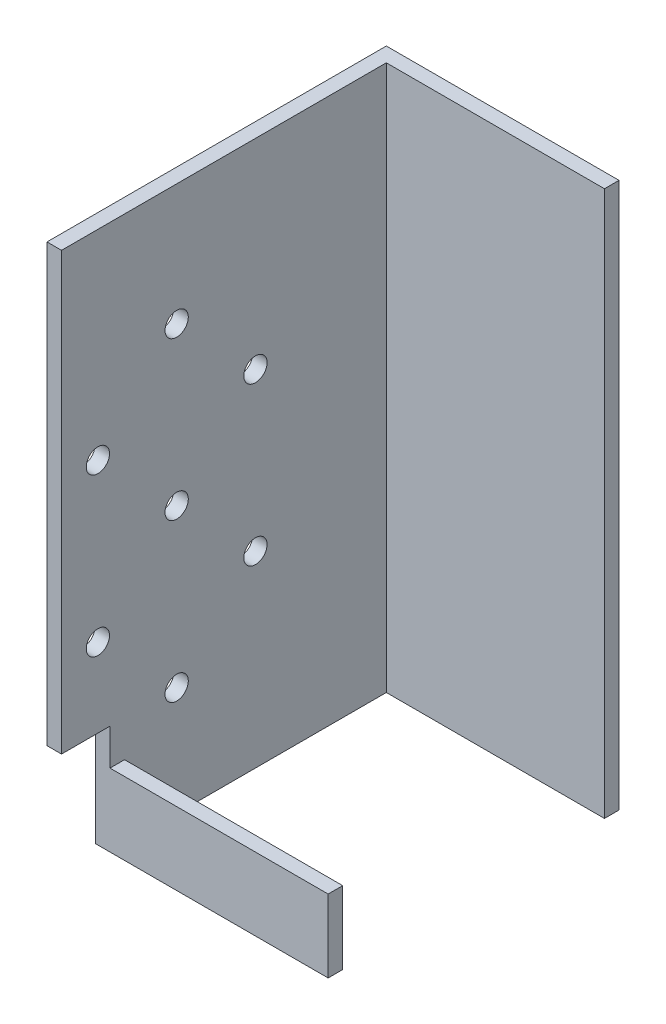
ISO-10303-21;
HEADER;
FILE_DESCRIPTION(('STEP AP214'),'2;1');
FILE_NAME('part.step','',(''),(''),'','','');
FILE_SCHEMA(('AUTOMOTIVE_DESIGN { 1 0 10303 214 1 1 1 1 }'));
ENDSEC;
DATA;
#1=APPLICATION_CONTEXT('core data for automotive mechanical design processes');
#2=APPLICATION_PROTOCOL_DEFINITION('international standard','automotive_design',2000,#1);
#3=PRODUCT_CONTEXT('',#1,'mechanical');
#4=PRODUCT('Part','Part','',(#3));
#5=PRODUCT_RELATED_PRODUCT_CATEGORY('part','',(#4));
#6=PRODUCT_DEFINITION_FORMATION('','',#4);
#7=PRODUCT_DEFINITION_CONTEXT('part definition',#1,'design');
#8=PRODUCT_DEFINITION('design','',#6,#7);
#9=PRODUCT_DEFINITION_SHAPE('','',#8);
#10=(LENGTH_UNIT() NAMED_UNIT(*) SI_UNIT(.MILLI.,.METRE.));
#11=(NAMED_UNIT(*) PLANE_ANGLE_UNIT() SI_UNIT($,.RADIAN.));
#12=(NAMED_UNIT(*) SI_UNIT($,.STERADIAN.) SOLID_ANGLE_UNIT());
#13=UNCERTAINTY_MEASURE_WITH_UNIT(LENGTH_MEASURE(1.E-05),#10,'distance_accuracy_value','');
#14=(GEOMETRIC_REPRESENTATION_CONTEXT(3) GLOBAL_UNCERTAINTY_ASSIGNED_CONTEXT((#13)) GLOBAL_UNIT_ASSIGNED_CONTEXT((#10,
#11,#12)) REPRESENTATION_CONTEXT('',''));
#15=CARTESIAN_POINT('',(0.,0.,0.));
#16=DIRECTION('',(0.,0.,1.));
#17=DIRECTION('',(1.,0.,0.));
#18=AXIS2_PLACEMENT_3D('',#15,#16,#17);
#19=CARTESIAN_POINT('',(1.524,0.,0.));
#20=DIRECTION('',(-1.,0.,0.));
#21=DIRECTION('',(0.,0.,1.));
#22=AXIS2_PLACEMENT_3D('',#19,#20,#21);
#23=PLANE('',#22);
#24=CARTESIAN_POINT('',(1.524,36.195,1.27));
#25=DIRECTION('',(1.,0.,0.));
#26=DIRECTION('',(0.,0.,-1.));
#27=AXIS2_PLACEMENT_3D('',#24,#25,#26);
#28=CIRCLE('',#27,1.21919999999999);
#29=CARTESIAN_POINT('',(1.524,36.195,0.0508000000000088));
#30=VERTEX_POINT('',#29);
#31=EDGE_CURVE('E465',#30,#30,#28,.T.);
#32=ORIENTED_EDGE('',*,*,#31,.F.);
#33=EDGE_LOOP('',(#32));
#34=FACE_BOUND('',#33,.T.);
#35=CARTESIAN_POINT('',(1.524,36.195,-15.24));
#36=DIRECTION('',(1.,0.,0.));
#37=DIRECTION('',(0.,0.,-1.));
#38=AXIS2_PLACEMENT_3D('',#35,#36,#37);
#39=CIRCLE('',#38,1.21919999999999);
#40=CARTESIAN_POINT('',(1.524,36.195,-16.4592));
#41=VERTEX_POINT('',#40);
#42=EDGE_CURVE('E467',#41,#41,#39,.T.);
#43=ORIENTED_EDGE('',*,*,#42,.F.);
#44=EDGE_LOOP('',(#43));
#45=FACE_BOUND('',#44,.T.);
#46=CARTESIAN_POINT('',(1.524,44.45,-6.985));
#47=DIRECTION('',(1.,0.,0.));
#48=DIRECTION('',(0.,0.,-1.));
#49=AXIS2_PLACEMENT_3D('',#46,#47,#48);
#50=CIRCLE('',#49,1.21919999999999);
#51=CARTESIAN_POINT('',(1.524,44.45,-8.20419999999999));
#52=VERTEX_POINT('',#51);
#53=EDGE_CURVE('E475',#52,#52,#50,.T.);
#54=ORIENTED_EDGE('',*,*,#53,.F.);
#55=EDGE_LOOP('',(#54));
#56=FACE_BOUND('',#55,.T.);
#57=CARTESIAN_POINT('',(1.524,27.94,-6.985));
#58=DIRECTION('',(1.,0.,0.));
#59=DIRECTION('',(0.,0.,-1.));
#60=AXIS2_PLACEMENT_3D('',#57,#58,#59);
#61=CIRCLE('',#60,1.21919999999999);
#62=CARTESIAN_POINT('',(1.524,27.94,-8.20419999999999));
#63=VERTEX_POINT('',#62);
#64=EDGE_CURVE('E481',#63,#63,#61,.T.);
#65=ORIENTED_EDGE('',*,*,#64,.F.);
#66=EDGE_LOOP('',(#65));
#67=FACE_BOUND('',#66,.T.);
#68=CARTESIAN_POINT('',(1.524,11.43,-6.985));
#69=DIRECTION('',(1.,0.,0.));
#70=DIRECTION('',(0.,0.,-1.));
#71=AXIS2_PLACEMENT_3D('',#68,#69,#70);
#72=CIRCLE('',#71,1.21919999999999);
#73=CARTESIAN_POINT('',(1.524,11.43,-8.20419999999999));
#74=VERTEX_POINT('',#73);
#75=EDGE_CURVE('E487',#74,#74,#72,.T.);
#76=ORIENTED_EDGE('',*,*,#75,.F.);
#77=EDGE_LOOP('',(#76));
#78=FACE_BOUND('',#77,.T.);
#79=CARTESIAN_POINT('',(1.524,19.685,-15.24));
#80=DIRECTION('',(1.,0.,0.));
#81=DIRECTION('',(0.,0.,-1.));
#82=AXIS2_PLACEMENT_3D('',#79,#80,#81);
#83=CIRCLE('',#82,1.21919999999999);
#84=CARTESIAN_POINT('',(1.524,19.685,-16.4592));
#85=VERTEX_POINT('',#84);
#86=EDGE_CURVE('E493',#85,#85,#83,.T.);
#87=ORIENTED_EDGE('',*,*,#86,.F.);
#88=EDGE_LOOP('',(#87));
#89=FACE_BOUND('',#88,.T.);
#90=DIRECTION('',(0.,1.,0.));
#91=VECTOR('',#90,1.);
#92=CARTESIAN_POINT('',(1.524,0.,-1.524));
#93=LINE('',#92,#91);
#94=CARTESIAN_POINT('',(1.524,0.,-1.524));
#95=VERTEX_POINT('',#94);
#96=CARTESIAN_POINT('',(1.524,7.62,-1.524));
#97=VERTEX_POINT('',#96);
#98=EDGE_CURVE('E169',#95,#97,#93,.T.);
#99=ORIENTED_EDGE('',*,*,#98,.F.);
#100=DIRECTION('',(0.,0.,-1.));
#101=VECTOR('',#100,1.);
#102=CARTESIAN_POINT('',(1.524,0.,0.));
#103=LINE('',#102,#101);
#104=CARTESIAN_POINT('',(1.524,0.,-28.956));
#105=VERTEX_POINT('',#104);
#106=EDGE_CURVE('E130',#95,#105,#103,.T.);
#107=ORIENTED_EDGE('',*,*,#106,.T.);
#108=DIRECTION('',(0.,-1.,0.));
#109=VECTOR('',#108,1.);
#110=CARTESIAN_POINT('',(1.524,0.,-28.956));
#111=LINE('',#110,#109);
#112=CARTESIAN_POINT('',(1.524,57.15,-28.956));
#113=VERTEX_POINT('',#112);
#114=EDGE_CURVE('E125',#113,#105,#111,.T.);
#115=ORIENTED_EDGE('',*,*,#114,.F.);
#116=DIRECTION('',(0.,0.,1.));
#117=VECTOR('',#116,1.);
#118=CARTESIAN_POINT('',(1.524,57.15,0.));
#119=LINE('',#118,#117);
#120=CARTESIAN_POINT('',(1.524,57.15,5.08));
#121=VERTEX_POINT('',#120);
#122=EDGE_CURVE('E118',#113,#121,#119,.T.);
#123=ORIENTED_EDGE('',*,*,#122,.T.);
#124=DIRECTION('',(0.,1.,0.));
#125=VECTOR('',#124,1.);
#126=CARTESIAN_POINT('',(1.524,57.15,5.08));
#127=LINE('',#126,#125);
#128=CARTESIAN_POINT('',(1.52400000000001,11.43,5.08));
#129=VERTEX_POINT('',#128);
#130=EDGE_CURVE('E123',#129,#121,#127,.T.);
#131=ORIENTED_EDGE('',*,*,#130,.F.);
#132=DIRECTION('',(0.,0.,-1.));
#133=VECTOR('',#132,1.);
#134=CARTESIAN_POINT('',(1.52400000000001,11.43,5.08));
#135=LINE('',#134,#133);
#136=CARTESIAN_POINT('',(1.52400000000001,11.43,0.));
#137=VERTEX_POINT('',#136);
#138=EDGE_CURVE('E154',#129,#137,#135,.T.);
#139=ORIENTED_EDGE('',*,*,#138,.T.);
#140=DIRECTION('',(0.,-1.,0.));
#141=VECTOR('',#140,1.);
#142=CARTESIAN_POINT('',(1.524,0.,0.));
#143=LINE('',#142,#141);
#144=CARTESIAN_POINT('',(1.524,7.62,0.));
#145=VERTEX_POINT('',#144);
#146=EDGE_CURVE('E161',#137,#145,#143,.T.);
#147=ORIENTED_EDGE('',*,*,#146,.T.);
#148=DIRECTION('',(0.,0.,1.));
#149=VECTOR('',#148,1.);
#150=CARTESIAN_POINT('',(1.524,7.62,0.));
#151=LINE('',#150,#149);
#152=EDGE_CURVE('E58',#97,#145,#151,.T.);
#153=ORIENTED_EDGE('',*,*,#152,.F.);
#154=EDGE_LOOP('',(#99,#107,#115,#123,#131,#139,#147,#153));
#155=FACE_BOUND('',#154,.T.);
#156=CARTESIAN_POINT('',(1.524,19.685,1.27));
#157=DIRECTION('',(1.,0.,0.));
#158=DIRECTION('',(0.,0.,-1.));
#159=AXIS2_PLACEMENT_3D('',#156,#157,#158);
#160=CIRCLE('',#159,1.21919999999999);
#161=CARTESIAN_POINT('',(1.524,19.685,0.0508000000000086));
#162=VERTEX_POINT('',#161);
#163=EDGE_CURVE('E149',#162,#162,#160,.T.);
#164=ORIENTED_EDGE('',*,*,#163,.F.);
#165=EDGE_LOOP('',(#164));
#166=FACE_BOUND('',#165,.T.);
#167=ADVANCED_FACE('F33',(#34,#45,#56,#67,#78,#89,#155,#166),#23,.F.);
#168=CARTESIAN_POINT('',(1.524,0.,0.));
#169=DIRECTION('',(0.,0.,-1.));
#170=DIRECTION('',(0.,1.,0.));
#171=AXIS2_PLACEMENT_3D('',#168,#169,#170);
#172=PLANE('',#171);
#173=DIRECTION('',(1.,0.,0.));
#174=VECTOR('',#173,1.);
#175=CARTESIAN_POINT('',(1.52400000000001,11.43,0.));
#176=LINE('',#175,#174);
#177=CARTESIAN_POINT('',(0.,11.43,0.));
#178=VERTEX_POINT('',#177);
#179=EDGE_CURVE('E50',#178,#137,#176,.T.);
#180=ORIENTED_EDGE('',*,*,#179,.F.);
#181=DIRECTION('',(0.,-1.,0.));
#182=VECTOR('',#181,1.);
#183=CARTESIAN_POINT('',(0.,0.,0.));
#184=LINE('',#183,#182);
#185=CARTESIAN_POINT('',(0.,0.,0.));
#186=VERTEX_POINT('',#185);
#187=EDGE_CURVE('E213',#178,#186,#184,.T.);
#188=ORIENTED_EDGE('',*,*,#187,.T.);
#189=DIRECTION('',(-1.,0.,0.));
#190=VECTOR('',#189,1.);
#191=CARTESIAN_POINT('',(1.524,0.,0.));
#192=LINE('',#191,#190);
#193=CARTESIAN_POINT('',(24.384,0.,0.));
#194=VERTEX_POINT('',#193);
#195=EDGE_CURVE('E11',#194,#186,#192,.T.);
#196=ORIENTED_EDGE('',*,*,#195,.F.);
#197=DIRECTION('',(0.,-1.,0.));
#198=VECTOR('',#197,1.);
#199=CARTESIAN_POINT('',(24.384,0.,0.));
#200=LINE('',#199,#198);
#201=CARTESIAN_POINT('',(24.384,7.62,0.));
#202=VERTEX_POINT('',#201);
#203=EDGE_CURVE('E157',#202,#194,#200,.T.);
#204=ORIENTED_EDGE('',*,*,#203,.F.);
#205=DIRECTION('',(-1.,0.,0.));
#206=VECTOR('',#205,1.);
#207=CARTESIAN_POINT('',(24.384,7.62,0.));
#208=LINE('',#207,#206);
#209=EDGE_CURVE('E183',#202,#145,#208,.T.);
#210=ORIENTED_EDGE('',*,*,#209,.T.);
#211=ORIENTED_EDGE('',*,*,#146,.F.);
#212=EDGE_LOOP('',(#180,#188,#196,#204,#210,#211));
#213=FACE_BOUND('',#212,.T.);
#214=ADVANCED_FACE('F35',(#213),#172,.F.);
#215=CARTESIAN_POINT('',(1.524,0.,0.));
#216=DIRECTION('',(0.,1.,0.));
#217=DIRECTION('',(0.,0.,1.));
#218=AXIS2_PLACEMENT_3D('',#215,#216,#217);
#219=PLANE('',#218);
#220=DIRECTION('',(0.,0.,-1.));
#221=VECTOR('',#220,1.);
#222=CARTESIAN_POINT('',(0.,0.,0.));
#223=LINE('',#222,#221);
#224=CARTESIAN_POINT('',(0.,0.,-30.48));
#225=VERTEX_POINT('',#224);
#226=EDGE_CURVE('E221',#186,#225,#223,.T.);
#227=ORIENTED_EDGE('',*,*,#226,.T.);
#228=DIRECTION('',(-1.,0.,0.));
#229=VECTOR('',#228,1.);
#230=CARTESIAN_POINT('',(1.524,0.,-30.48));
#231=LINE('',#230,#229);
#232=CARTESIAN_POINT('',(24.384,0.,-30.48));
#233=VERTEX_POINT('',#232);
#234=EDGE_CURVE('E42',#233,#225,#231,.T.);
#235=ORIENTED_EDGE('',*,*,#234,.F.);
#236=DIRECTION('',(0.,0.,-1.));
#237=VECTOR('',#236,1.);
#238=CARTESIAN_POINT('',(24.384,0.,-30.48));
#239=LINE('',#238,#237);
#240=CARTESIAN_POINT('',(24.384,0.,-28.956));
#241=VERTEX_POINT('',#240);
#242=EDGE_CURVE('E197',#241,#233,#239,.T.);
#243=ORIENTED_EDGE('',*,*,#242,.F.);
#244=DIRECTION('',(-1.,0.,0.));
#245=VECTOR('',#244,1.);
#246=CARTESIAN_POINT('',(24.384,0.,-28.956));
#247=LINE('',#246,#245);
#248=EDGE_CURVE('E200',#241,#105,#247,.T.);
#249=ORIENTED_EDGE('',*,*,#248,.T.);
#250=ORIENTED_EDGE('',*,*,#106,.F.);
#251=DIRECTION('',(-1.,0.,0.));
#252=VECTOR('',#251,1.);
#253=CARTESIAN_POINT('',(24.384,0.,-1.524));
#254=LINE('',#253,#252);
#255=CARTESIAN_POINT('',(24.384,0.,-1.524));
#256=VERTEX_POINT('',#255);
#257=EDGE_CURVE('E188',#256,#95,#254,.T.);
#258=ORIENTED_EDGE('',*,*,#257,.F.);
#259=DIRECTION('',(0.,0.,-1.));
#260=VECTOR('',#259,1.);
#261=CARTESIAN_POINT('',(24.384,0.,0.));
#262=LINE('',#261,#260);
#263=EDGE_CURVE('E246',#194,#256,#262,.T.);
#264=ORIENTED_EDGE('',*,*,#263,.F.);
#265=ORIENTED_EDGE('',*,*,#195,.T.);
#266=EDGE_LOOP('',(#227,#235,#243,#249,#250,#258,#264,#265));
#267=FACE_BOUND('',#266,.T.);
#268=ADVANCED_FACE('F266',(#267),#219,.F.);
#269=CARTESIAN_POINT('',(1.524,0.,-30.48));
#270=DIRECTION('',(0.,0.,1.));
#271=DIRECTION('',(0.,-1.,0.));
#272=AXIS2_PLACEMENT_3D('',#269,#270,#271);
#273=PLANE('',#272);
#274=DIRECTION('',(0.,1.,0.));
#275=VECTOR('',#274,1.);
#276=CARTESIAN_POINT('',(0.,0.,-30.48));
#277=LINE('',#276,#275);
#278=CARTESIAN_POINT('',(0.,57.15,-30.48));
#279=VERTEX_POINT('',#278);
#280=EDGE_CURVE('E223',#225,#279,#277,.T.);
#281=ORIENTED_EDGE('',*,*,#280,.T.);
#282=DIRECTION('',(-1.,0.,0.));
#283=VECTOR('',#282,1.);
#284=CARTESIAN_POINT('',(1.524,57.15,-30.48));
#285=LINE('',#284,#283);
#286=CARTESIAN_POINT('',(24.384,57.15,-30.48));
#287=VERTEX_POINT('',#286);
#288=EDGE_CURVE('E129',#287,#279,#285,.T.);
#289=ORIENTED_EDGE('',*,*,#288,.F.);
#290=DIRECTION('',(0.,1.,0.));
#291=VECTOR('',#290,1.);
#292=CARTESIAN_POINT('',(24.384,0.,-30.48));
#293=LINE('',#292,#291);
#294=EDGE_CURVE('E190',#233,#287,#293,.T.);
#295=ORIENTED_EDGE('',*,*,#294,.F.);
#296=ORIENTED_EDGE('',*,*,#234,.T.);
#297=EDGE_LOOP('',(#281,#289,#295,#296));
#298=FACE_BOUND('',#297,.T.);
#299=ADVANCED_FACE('F231',(#298),#273,.F.);
#300=CARTESIAN_POINT('',(1.524,57.15,0.));
#301=DIRECTION('',(0.,-1.,0.));
#302=DIRECTION('',(0.,0.,-1.));
#303=AXIS2_PLACEMENT_3D('',#300,#301,#302);
#304=PLANE('',#303);
#305=DIRECTION('',(0.,0.,1.));
#306=VECTOR('',#305,1.);
#307=CARTESIAN_POINT('',(0.,57.15,0.));
#308=LINE('',#307,#306);
#309=CARTESIAN_POINT('',(0.,57.15,5.08));
#310=VERTEX_POINT('',#309);
#311=EDGE_CURVE('E137',#279,#310,#308,.T.);
#312=ORIENTED_EDGE('',*,*,#311,.T.);
#313=DIRECTION('',(-1.,0.,0.));
#314=VECTOR('',#313,1.);
#315=CARTESIAN_POINT('',(1.524,57.15,5.08));
#316=LINE('',#315,#314);
#317=EDGE_CURVE('E133',#121,#310,#316,.T.);
#318=ORIENTED_EDGE('',*,*,#317,.F.);
#319=ORIENTED_EDGE('',*,*,#122,.F.);
#320=DIRECTION('',(-1.,0.,0.));
#321=VECTOR('',#320,1.);
#322=CARTESIAN_POINT('',(24.384,57.15,-28.956));
#323=LINE('',#322,#321);
#324=CARTESIAN_POINT('',(24.384,57.15,-28.956));
#325=VERTEX_POINT('',#324);
#326=EDGE_CURVE('E209',#325,#113,#323,.T.);
#327=ORIENTED_EDGE('',*,*,#326,.F.);
#328=DIRECTION('',(0.,0.,1.));
#329=VECTOR('',#328,1.);
#330=CARTESIAN_POINT('',(24.384,57.15,-30.48));
#331=LINE('',#330,#329);
#332=EDGE_CURVE('E193',#287,#325,#331,.T.);
#333=ORIENTED_EDGE('',*,*,#332,.F.);
#334=ORIENTED_EDGE('',*,*,#288,.T.);
#335=EDGE_LOOP('',(#312,#318,#319,#327,#333,#334));
#336=FACE_BOUND('',#335,.T.);
#337=ADVANCED_FACE('F134',(#336),#304,.F.);
#338=CARTESIAN_POINT('',(0.,0.,0.));
#339=DIRECTION('',(-1.,0.,0.));
#340=DIRECTION('',(0.,0.,1.));
#341=AXIS2_PLACEMENT_3D('',#338,#339,#340);
#342=PLANE('',#341);
#343=CARTESIAN_POINT('',(0.,36.195,1.27));
#344=DIRECTION('',(-1.,0.,0.));
#345=DIRECTION('',(0.,0.,1.));
#346=AXIS2_PLACEMENT_3D('',#343,#344,#345);
#347=CIRCLE('',#346,1.21919999999999);
#348=CARTESIAN_POINT('',(0.,36.195,2.48919999999999));
#349=VERTEX_POINT('',#348);
#350=EDGE_CURVE('E463',#349,#349,#347,.T.);
#351=ORIENTED_EDGE('',*,*,#350,.F.);
#352=EDGE_LOOP('',(#351));
#353=FACE_BOUND('',#352,.T.);
#354=CARTESIAN_POINT('',(0.,36.195,-15.24));
#355=DIRECTION('',(-1.,0.,0.));
#356=DIRECTION('',(0.,0.,1.));
#357=AXIS2_PLACEMENT_3D('',#354,#355,#356);
#358=CIRCLE('',#357,1.21919999999999);
#359=CARTESIAN_POINT('',(0.,36.195,-14.0208));
#360=VERTEX_POINT('',#359);
#361=EDGE_CURVE('E472',#360,#360,#358,.T.);
#362=ORIENTED_EDGE('',*,*,#361,.F.);
#363=EDGE_LOOP('',(#362));
#364=FACE_BOUND('',#363,.T.);
#365=CARTESIAN_POINT('',(0.,44.45,-6.985));
#366=DIRECTION('',(-1.,0.,0.));
#367=DIRECTION('',(0.,0.,1.));
#368=AXIS2_PLACEMENT_3D('',#365,#366,#367);
#369=CIRCLE('',#368,1.21919999999999);
#370=CARTESIAN_POINT('',(0.,44.45,-5.76580000000001));
#371=VERTEX_POINT('',#370);
#372=EDGE_CURVE('E478',#371,#371,#369,.T.);
#373=ORIENTED_EDGE('',*,*,#372,.F.);
#374=EDGE_LOOP('',(#373));
#375=FACE_BOUND('',#374,.T.);
#376=CARTESIAN_POINT('',(0.,27.94,-6.985));
#377=DIRECTION('',(-1.,0.,0.));
#378=DIRECTION('',(0.,0.,1.));
#379=AXIS2_PLACEMENT_3D('',#376,#377,#378);
#380=CIRCLE('',#379,1.21919999999999);
#381=CARTESIAN_POINT('',(0.,27.94,-5.76580000000001));
#382=VERTEX_POINT('',#381);
#383=EDGE_CURVE('E484',#382,#382,#380,.T.);
#384=ORIENTED_EDGE('',*,*,#383,.F.);
#385=EDGE_LOOP('',(#384));
#386=FACE_BOUND('',#385,.T.);
#387=CARTESIAN_POINT('',(0.,11.43,-6.985));
#388=DIRECTION('',(-1.,0.,0.));
#389=DIRECTION('',(0.,0.,1.));
#390=AXIS2_PLACEMENT_3D('',#387,#388,#389);
#391=CIRCLE('',#390,1.21919999999999);
#392=CARTESIAN_POINT('',(0.,11.43,-5.76580000000001));
#393=VERTEX_POINT('',#392);
#394=EDGE_CURVE('E490',#393,#393,#391,.T.);
#395=ORIENTED_EDGE('',*,*,#394,.F.);
#396=EDGE_LOOP('',(#395));
#397=FACE_BOUND('',#396,.T.);
#398=CARTESIAN_POINT('',(0.,19.685,-15.24));
#399=DIRECTION('',(-1.,0.,0.));
#400=DIRECTION('',(0.,0.,1.));
#401=AXIS2_PLACEMENT_3D('',#398,#399,#400);
#402=CIRCLE('',#401,1.21919999999999);
#403=CARTESIAN_POINT('',(0.,19.685,-14.0208));
#404=VERTEX_POINT('',#403);
#405=EDGE_CURVE('E495',#404,#404,#402,.T.);
#406=ORIENTED_EDGE('',*,*,#405,.F.);
#407=EDGE_LOOP('',(#406));
#408=FACE_BOUND('',#407,.T.);
#409=CARTESIAN_POINT('',(0.,19.685,1.27));
#410=DIRECTION('',(-1.,0.,0.));
#411=DIRECTION('',(0.,0.,1.));
#412=AXIS2_PLACEMENT_3D('',#409,#410,#411);
#413=CIRCLE('',#412,1.21919999999999);
#414=CARTESIAN_POINT('',(0.,19.685,2.48919999999999));
#415=VERTEX_POINT('',#414);
#416=EDGE_CURVE('E37',#415,#415,#413,.T.);
#417=ORIENTED_EDGE('',*,*,#416,.F.);
#418=EDGE_LOOP('',(#417));
#419=FACE_BOUND('',#418,.T.);
#420=ORIENTED_EDGE('',*,*,#187,.F.);
#421=DIRECTION('',(0.,0.,-1.));
#422=VECTOR('',#421,1.);
#423=CARTESIAN_POINT('',(0.,11.43,5.08));
#424=LINE('',#423,#422);
#425=CARTESIAN_POINT('',(0.,11.43,5.08));
#426=VERTEX_POINT('',#425);
#427=EDGE_CURVE('E165',#426,#178,#424,.T.);
#428=ORIENTED_EDGE('',*,*,#427,.F.);
#429=DIRECTION('',(0.,-1.,0.));
#430=VECTOR('',#429,1.);
#431=CARTESIAN_POINT('',(0.,57.15,5.08));
#432=LINE('',#431,#430);
#433=EDGE_CURVE('E140',#310,#426,#432,.T.);
#434=ORIENTED_EDGE('',*,*,#433,.F.);
#435=ORIENTED_EDGE('',*,*,#311,.F.);
#436=ORIENTED_EDGE('',*,*,#280,.F.);
#437=ORIENTED_EDGE('',*,*,#226,.F.);
#438=EDGE_LOOP('',(#420,#428,#434,#435,#436,#437));
#439=FACE_BOUND('',#438,.T.);
#440=ADVANCED_FACE('F236',(#353,#364,#375,#386,#397,#408,#419,#439),#342,.T.);
#441=CARTESIAN_POINT('',(24.384,0.,-28.956));
#442=DIRECTION('',(0.,0.,-1.));
#443=DIRECTION('',(-1.,0.,0.));
#444=AXIS2_PLACEMENT_3D('',#441,#442,#443);
#445=PLANE('',#444);
#446=ORIENTED_EDGE('',*,*,#114,.T.);
#447=ORIENTED_EDGE('',*,*,#248,.F.);
#448=DIRECTION('',(0.,-1.,0.));
#449=VECTOR('',#448,1.);
#450=CARTESIAN_POINT('',(24.384,0.,-28.956));
#451=LINE('',#450,#449);
#452=EDGE_CURVE('E195',#325,#241,#451,.T.);
#453=ORIENTED_EDGE('',*,*,#452,.F.);
#454=ORIENTED_EDGE('',*,*,#326,.T.);
#455=EDGE_LOOP('',(#446,#447,#453,#454));
#456=FACE_BOUND('',#455,.T.);
#457=ADVANCED_FACE('F271',(#456),#445,.F.);
#458=CARTESIAN_POINT('',(24.384,0.,0.));
#459=DIRECTION('',(1.,0.,0.));
#460=DIRECTION('',(0.,0.,-1.));
#461=AXIS2_PLACEMENT_3D('',#458,#459,#460);
#462=PLANE('',#461);
#463=ORIENTED_EDGE('',*,*,#294,.T.);
#464=ORIENTED_EDGE('',*,*,#332,.T.);
#465=ORIENTED_EDGE('',*,*,#452,.T.);
#466=ORIENTED_EDGE('',*,*,#242,.T.);
#467=EDGE_LOOP('',(#463,#464,#465,#466));
#468=FACE_BOUND('',#467,.T.);
#469=ADVANCED_FACE('F283',(#468),#462,.T.);
#470=CARTESIAN_POINT('',(24.384,0.,-1.524));
#471=DIRECTION('',(0.,0.,1.));
#472=DIRECTION('',(0.,-1.,0.));
#473=AXIS2_PLACEMENT_3D('',#470,#471,#472);
#474=PLANE('',#473);
#475=ORIENTED_EDGE('',*,*,#98,.T.);
#476=DIRECTION('',(-1.,0.,0.));
#477=VECTOR('',#476,1.);
#478=CARTESIAN_POINT('',(24.384,7.62,-1.524));
#479=LINE('',#478,#477);
#480=CARTESIAN_POINT('',(24.384,7.62,-1.524));
#481=VERTEX_POINT('',#480);
#482=EDGE_CURVE('E186',#481,#97,#479,.T.);
#483=ORIENTED_EDGE('',*,*,#482,.F.);
#484=DIRECTION('',(0.,1.,0.));
#485=VECTOR('',#484,1.);
#486=CARTESIAN_POINT('',(24.384,0.,-1.524));
#487=LINE('',#486,#485);
#488=EDGE_CURVE('E247',#256,#481,#487,.T.);
#489=ORIENTED_EDGE('',*,*,#488,.F.);
#490=ORIENTED_EDGE('',*,*,#257,.T.);
#491=EDGE_LOOP('',(#475,#483,#489,#490));
#492=FACE_BOUND('',#491,.T.);
#493=ADVANCED_FACE('F258',(#492),#474,.F.);
#494=CARTESIAN_POINT('',(24.384,7.62,0.));
#495=DIRECTION('',(0.,-1.,0.));
#496=DIRECTION('',(0.,0.,-1.));
#497=AXIS2_PLACEMENT_3D('',#494,#495,#496);
#498=PLANE('',#497);
#499=ORIENTED_EDGE('',*,*,#152,.T.);
#500=ORIENTED_EDGE('',*,*,#209,.F.);
#501=DIRECTION('',(0.,0.,1.));
#502=VECTOR('',#501,1.);
#503=CARTESIAN_POINT('',(24.384,7.62,0.));
#504=LINE('',#503,#502);
#505=EDGE_CURVE('E180',#481,#202,#504,.T.);
#506=ORIENTED_EDGE('',*,*,#505,.F.);
#507=ORIENTED_EDGE('',*,*,#482,.T.);
#508=EDGE_LOOP('',(#499,#500,#506,#507));
#509=FACE_BOUND('',#508,.T.);
#510=ADVANCED_FACE('F240',(#509),#498,.F.);
#511=CARTESIAN_POINT('',(24.384,0.,0.));
#512=DIRECTION('',(-1.,0.,0.));
#513=DIRECTION('',(0.,0.,1.));
#514=AXIS2_PLACEMENT_3D('',#511,#512,#513);
#515=PLANE('',#514);
#516=ORIENTED_EDGE('',*,*,#203,.T.);
#517=ORIENTED_EDGE('',*,*,#263,.T.);
#518=ORIENTED_EDGE('',*,*,#488,.T.);
#519=ORIENTED_EDGE('',*,*,#505,.T.);
#520=EDGE_LOOP('',(#516,#517,#518,#519));
#521=FACE_BOUND('',#520,.T.);
#522=ADVANCED_FACE('F250',(#521),#515,.F.);
#523=CARTESIAN_POINT('',(1.52400000000001,11.43,5.08));
#524=DIRECTION('',(0.,1.,0.));
#525=DIRECTION('',(0.,0.,1.));
#526=AXIS2_PLACEMENT_3D('',#523,#524,#525);
#527=PLANE('',#526);
#528=ORIENTED_EDGE('',*,*,#179,.T.);
#529=ORIENTED_EDGE('',*,*,#138,.F.);
#530=DIRECTION('',(1.,0.,0.));
#531=VECTOR('',#530,1.);
#532=CARTESIAN_POINT('',(1.52400000000001,11.43,5.08));
#533=LINE('',#532,#531);
#534=EDGE_CURVE('E144',#426,#129,#533,.T.);
#535=ORIENTED_EDGE('',*,*,#534,.F.);
#536=ORIENTED_EDGE('',*,*,#427,.T.);
#537=EDGE_LOOP('',(#528,#529,#535,#536));
#538=FACE_BOUND('',#537,.T.);
#539=ADVANCED_FACE('F237',(#538),#527,.F.);
#540=CARTESIAN_POINT('',(0.,0.,5.08));
#541=DIRECTION('',(0.,0.,-1.));
#542=DIRECTION('',(-1.,0.,0.));
#543=AXIS2_PLACEMENT_3D('',#540,#541,#542);
#544=PLANE('',#543);
#545=ORIENTED_EDGE('',*,*,#130,.T.);
#546=ORIENTED_EDGE('',*,*,#317,.T.);
#547=ORIENTED_EDGE('',*,*,#433,.T.);
#548=ORIENTED_EDGE('',*,*,#534,.T.);
#549=EDGE_LOOP('',(#545,#546,#547,#548));
#550=FACE_BOUND('',#549,.T.);
#551=ADVANCED_FACE('F142',(#550),#544,.F.);
#552=CARTESIAN_POINT('',(1.524,19.685,1.27));
#553=DIRECTION('',(1.,0.,0.));
#554=DIRECTION('',(0.,0.,-1.));
#555=AXIS2_PLACEMENT_3D('',#552,#553,#554);
#556=CYLINDRICAL_SURFACE('',#555,1.21919999999999);
#557=ORIENTED_EDGE('',*,*,#416,.T.);
#558=EDGE_LOOP('',(#557));
#559=FACE_BOUND('',#558,.T.);
#560=ORIENTED_EDGE('',*,*,#163,.T.);
#561=EDGE_LOOP('',(#560));
#562=FACE_BOUND('',#561,.T.);
#563=ADVANCED_FACE('F381',(#559,#562),#556,.F.);
#564=CARTESIAN_POINT('',(1.524,19.685,-15.24));
#565=DIRECTION('',(1.,0.,0.));
#566=DIRECTION('',(0.,0.,-1.));
#567=AXIS2_PLACEMENT_3D('',#564,#565,#566);
#568=CYLINDRICAL_SURFACE('',#567,1.21919999999999);
#569=ORIENTED_EDGE('',*,*,#405,.T.);
#570=EDGE_LOOP('',(#569));
#571=FACE_BOUND('',#570,.T.);
#572=ORIENTED_EDGE('',*,*,#86,.T.);
#573=EDGE_LOOP('',(#572));
#574=FACE_BOUND('',#573,.T.);
#575=ADVANCED_FACE('F395',(#571,#574),#568,.F.);
#576=CARTESIAN_POINT('',(1.524,11.43,-6.985));
#577=DIRECTION('',(1.,0.,0.));
#578=DIRECTION('',(0.,0.,-1.));
#579=AXIS2_PLACEMENT_3D('',#576,#577,#578);
#580=CYLINDRICAL_SURFACE('',#579,1.21919999999999);
#581=ORIENTED_EDGE('',*,*,#394,.T.);
#582=EDGE_LOOP('',(#581));
#583=FACE_BOUND('',#582,.T.);
#584=ORIENTED_EDGE('',*,*,#75,.T.);
#585=EDGE_LOOP('',(#584));
#586=FACE_BOUND('',#585,.T.);
#587=ADVANCED_FACE('F404',(#583,#586),#580,.F.);
#588=CARTESIAN_POINT('',(1.524,27.94,-6.985));
#589=DIRECTION('',(1.,0.,0.));
#590=DIRECTION('',(0.,0.,-1.));
#591=AXIS2_PLACEMENT_3D('',#588,#589,#590);
#592=CYLINDRICAL_SURFACE('',#591,1.21919999999999);
#593=ORIENTED_EDGE('',*,*,#383,.T.);
#594=EDGE_LOOP('',(#593));
#595=FACE_BOUND('',#594,.T.);
#596=ORIENTED_EDGE('',*,*,#64,.T.);
#597=EDGE_LOOP('',(#596));
#598=FACE_BOUND('',#597,.T.);
#599=ADVANCED_FACE('F413',(#595,#598),#592,.F.);
#600=CARTESIAN_POINT('',(1.524,44.45,-6.985));
#601=DIRECTION('',(1.,0.,0.));
#602=DIRECTION('',(0.,0.,-1.));
#603=AXIS2_PLACEMENT_3D('',#600,#601,#602);
#604=CYLINDRICAL_SURFACE('',#603,1.21919999999999);
#605=ORIENTED_EDGE('',*,*,#372,.T.);
#606=EDGE_LOOP('',(#605));
#607=FACE_BOUND('',#606,.T.);
#608=ORIENTED_EDGE('',*,*,#53,.T.);
#609=EDGE_LOOP('',(#608));
#610=FACE_BOUND('',#609,.T.);
#611=ADVANCED_FACE('F422',(#607,#610),#604,.F.);
#612=CARTESIAN_POINT('',(1.524,36.195,-15.24));
#613=DIRECTION('',(1.,0.,0.));
#614=DIRECTION('',(0.,0.,-1.));
#615=AXIS2_PLACEMENT_3D('',#612,#613,#614);
#616=CYLINDRICAL_SURFACE('',#615,1.21919999999999);
#617=ORIENTED_EDGE('',*,*,#361,.T.);
#618=EDGE_LOOP('',(#617));
#619=FACE_BOUND('',#618,.T.);
#620=ORIENTED_EDGE('',*,*,#42,.T.);
#621=EDGE_LOOP('',(#620));
#622=FACE_BOUND('',#621,.T.);
#623=ADVANCED_FACE('F431',(#619,#622),#616,.F.);
#624=CARTESIAN_POINT('',(1.524,36.195,1.27));
#625=DIRECTION('',(1.,0.,0.));
#626=DIRECTION('',(0.,0.,-1.));
#627=AXIS2_PLACEMENT_3D('',#624,#625,#626);
#628=CYLINDRICAL_SURFACE('',#627,1.21919999999999);
#629=ORIENTED_EDGE('',*,*,#350,.T.);
#630=EDGE_LOOP('',(#629));
#631=FACE_BOUND('',#630,.T.);
#632=ORIENTED_EDGE('',*,*,#31,.T.);
#633=EDGE_LOOP('',(#632));
#634=FACE_BOUND('',#633,.T.);
#635=ADVANCED_FACE('F440',(#631,#634),#628,.F.);
#636=CLOSED_SHELL('',(#167,#214,#268,#299,#337,#440,#457,#469,#493,#510,#522,#539,#551,#563,
#575,#587,#599,#611,#623,#635));
#637=MANIFOLD_SOLID_BREP('B2',#636);
#638=ADVANCED_BREP_SHAPE_REPRESENTATION('',(#18,#637),#14);
#639=SHAPE_DEFINITION_REPRESENTATION(#9,#638);
ENDSEC;
END-ISO-10303-21;
